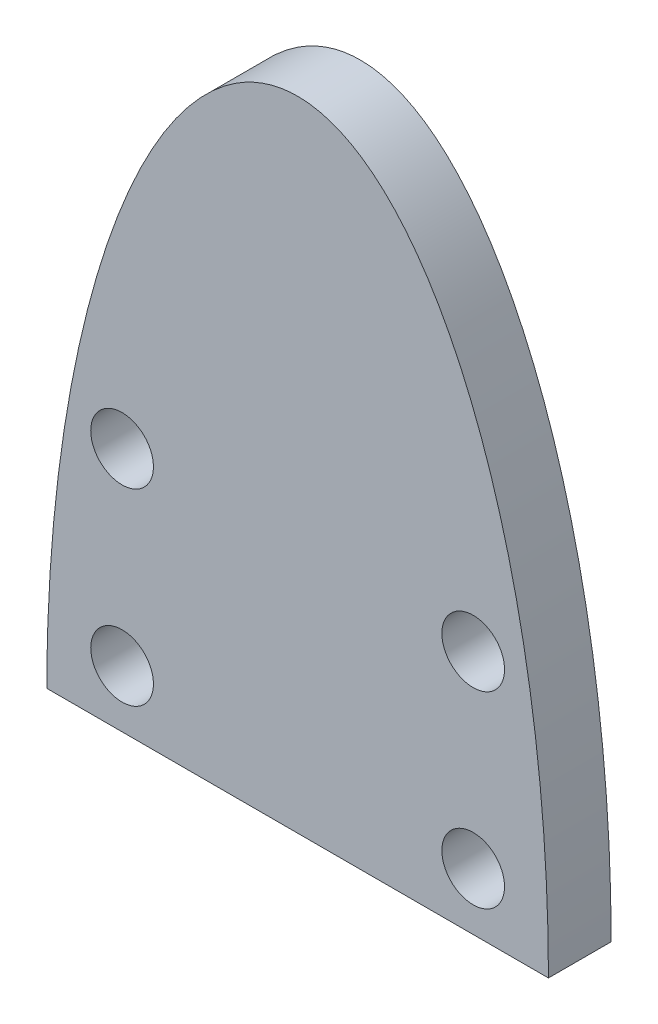
ISO-10303-21;
HEADER;
FILE_DESCRIPTION(('STEP AP214'),'2;1');
FILE_NAME('part.step','',(''),(''),'','','');
FILE_SCHEMA(('AUTOMOTIVE_DESIGN { 1 0 10303 214 1 1 1 1 }'));
ENDSEC;
DATA;
#1=APPLICATION_CONTEXT('core data for automotive mechanical design processes');
#2=APPLICATION_PROTOCOL_DEFINITION('international standard','automotive_design',2000,#1);
#3=PRODUCT_CONTEXT('',#1,'mechanical');
#4=PRODUCT('Part','Part','',(#3));
#5=PRODUCT_RELATED_PRODUCT_CATEGORY('part','',(#4));
#6=PRODUCT_DEFINITION_FORMATION('','',#4);
#7=PRODUCT_DEFINITION_CONTEXT('part definition',#1,'design');
#8=PRODUCT_DEFINITION('design','',#6,#7);
#9=PRODUCT_DEFINITION_SHAPE('','',#8);
#10=(LENGTH_UNIT() NAMED_UNIT(*) SI_UNIT(.MILLI.,.METRE.));
#11=(NAMED_UNIT(*) PLANE_ANGLE_UNIT() SI_UNIT($,.RADIAN.));
#12=(NAMED_UNIT(*) SI_UNIT($,.STERADIAN.) SOLID_ANGLE_UNIT());
#13=UNCERTAINTY_MEASURE_WITH_UNIT(LENGTH_MEASURE(1.E-05),#10,'distance_accuracy_value','');
#14=(GEOMETRIC_REPRESENTATION_CONTEXT(3) GLOBAL_UNCERTAINTY_ASSIGNED_CONTEXT((#13)) GLOBAL_UNIT_ASSIGNED_CONTEXT((#10,
#11,#12)) REPRESENTATION_CONTEXT('',''));
#15=CARTESIAN_POINT('',(0.,0.,0.));
#16=DIRECTION('',(0.,0.,1.));
#17=DIRECTION('',(1.,0.,0.));
#18=AXIS2_PLACEMENT_3D('',#15,#16,#17);
#19=CARTESIAN_POINT('',(50.8,0.,12.7));
#20=DIRECTION('',(0.,0.,1.));
#21=DIRECTION('',(0.,1.,0.));
#22=AXIS2_PLACEMENT_3D('',#19,#20,#21);
#23=ELLIPSE('',#22,129.286,50.8);
#24=DIRECTION('',(0.,0.,-1.));
#25=VECTOR('',#24,1.);
#26=SURFACE_OF_LINEAR_EXTRUSION('',#23,#25);
#27=CARTESIAN_POINT('',(50.8,0.,0.));
#28=DIRECTION('',(0.,0.,1.));
#29=DIRECTION('',(0.,1.,0.));
#30=AXIS2_PLACEMENT_3D('',#27,#28,#29);
#31=ELLIPSE('',#30,129.286,50.8);
#32=CARTESIAN_POINT('',(101.6,0.,0.));
#33=VERTEX_POINT('',#32);
#34=CARTESIAN_POINT('',(0.,0.,0.));
#35=VERTEX_POINT('',#34);
#36=EDGE_CURVE('E65',#33,#35,#31,.T.);
#37=ORIENTED_EDGE('',*,*,#36,.T.);
#38=DIRECTION('',(0.,0.,-1.));
#39=VECTOR('',#38,1.);
#40=CARTESIAN_POINT('',(0.,0.,12.7));
#41=LINE('',#40,#39);
#42=CARTESIAN_POINT('',(0.,0.,12.7));
#43=VERTEX_POINT('',#42);
#44=EDGE_CURVE('E11',#43,#35,#41,.T.);
#45=ORIENTED_EDGE('',*,*,#44,.F.);
#46=CARTESIAN_POINT('',(101.6,0.,12.7));
#47=VERTEX_POINT('',#46);
#48=EDGE_CURVE('E64',#47,#43,#23,.T.);
#49=ORIENTED_EDGE('',*,*,#48,.F.);
#50=DIRECTION('',(0.,0.,-1.));
#51=VECTOR('',#50,1.);
#52=CARTESIAN_POINT('',(101.6,0.,12.7));
#53=LINE('',#52,#51);
#54=EDGE_CURVE('E42',#47,#33,#53,.T.);
#55=ORIENTED_EDGE('',*,*,#54,.T.);
#56=EDGE_LOOP('',(#37,#45,#49,#55));
#57=FACE_BOUND('',#56,.T.);
#58=ADVANCED_FACE('F33',(#57),#26,.F.);
#59=CARTESIAN_POINT('',(0.,0.,12.7));
#60=DIRECTION('',(0.,1.,0.));
#61=DIRECTION('',(0.,0.,1.));
#62=AXIS2_PLACEMENT_3D('',#59,#60,#61);
#63=PLANE('',#62);
#64=DIRECTION('',(1.,0.,0.));
#65=VECTOR('',#64,1.);
#66=CARTESIAN_POINT('',(0.,0.,0.));
#67=LINE('',#66,#65);
#68=EDGE_CURVE('E57',#35,#33,#67,.T.);
#69=ORIENTED_EDGE('',*,*,#68,.T.);
#70=ORIENTED_EDGE('',*,*,#54,.F.);
#71=DIRECTION('',(1.,0.,0.));
#72=VECTOR('',#71,1.);
#73=CARTESIAN_POINT('',(0.,0.,12.7));
#74=LINE('',#73,#72);
#75=EDGE_CURVE('E49',#43,#47,#74,.T.);
#76=ORIENTED_EDGE('',*,*,#75,.F.);
#77=ORIENTED_EDGE('',*,*,#44,.T.);
#78=EDGE_LOOP('',(#69,#70,#76,#77));
#79=FACE_BOUND('',#78,.T.);
#80=ADVANCED_FACE('F60',(#79),#63,.F.);
#81=CARTESIAN_POINT('',(50.8,0.,12.7));
#82=DIRECTION('',(0.,0.,1.));
#83=DIRECTION('',(1.,0.,0.));
#84=AXIS2_PLACEMENT_3D('',#81,#82,#83);
#85=PLANE('',#84);
#86=CARTESIAN_POINT('',(86.36,11.5629463035803,12.7));
#87=DIRECTION('',(0.,0.,-1.));
#88=DIRECTION('',(-1.,0.,0.));
#89=AXIS2_PLACEMENT_3D('',#86,#87,#88);
#90=CIRCLE('',#89,6.35);
#91=CARTESIAN_POINT('',(80.01,11.5629463035803,12.7));
#92=VERTEX_POINT('',#91);
#93=EDGE_CURVE('E78',#92,#92,#90,.T.);
#94=ORIENTED_EDGE('',*,*,#93,.T.);
#95=EDGE_LOOP('',(#94));
#96=FACE_BOUND('',#95,.T.);
#97=CARTESIAN_POINT('',(15.24,49.6629463035803,12.7));
#98=DIRECTION('',(0.,0.,-1.));
#99=DIRECTION('',(-1.,0.,0.));
#100=AXIS2_PLACEMENT_3D('',#97,#98,#99);
#101=CIRCLE('',#100,6.35);
#102=CARTESIAN_POINT('',(8.89,49.6629463035803,12.7));
#103=VERTEX_POINT('',#102);
#104=EDGE_CURVE('E83',#103,#103,#101,.T.);
#105=ORIENTED_EDGE('',*,*,#104,.T.);
#106=EDGE_LOOP('',(#105));
#107=FACE_BOUND('',#106,.T.);
#108=CARTESIAN_POINT('',(15.24,11.5629463035803,12.7));
#109=DIRECTION('',(0.,0.,-1.));
#110=DIRECTION('',(-1.,0.,0.));
#111=AXIS2_PLACEMENT_3D('',#108,#109,#110);
#112=CIRCLE('',#111,6.35);
#113=CARTESIAN_POINT('',(8.89000000000001,11.5629463035803,12.7));
#114=VERTEX_POINT('',#113);
#115=EDGE_CURVE('E84',#114,#114,#112,.T.);
#116=ORIENTED_EDGE('',*,*,#115,.T.);
#117=EDGE_LOOP('',(#116));
#118=FACE_BOUND('',#117,.T.);
#119=CARTESIAN_POINT('',(86.36,49.6629463035803,12.7));
#120=DIRECTION('',(0.,0.,-1.));
#121=DIRECTION('',(-1.,0.,0.));
#122=AXIS2_PLACEMENT_3D('',#119,#120,#121);
#123=CIRCLE('',#122,6.35);
#124=CARTESIAN_POINT('',(80.01,49.6629463035803,12.7));
#125=VERTEX_POINT('',#124);
#126=EDGE_CURVE('E69',#125,#125,#123,.T.);
#127=ORIENTED_EDGE('',*,*,#126,.T.);
#128=EDGE_LOOP('',(#127));
#129=FACE_BOUND('',#128,.T.);
#130=ORIENTED_EDGE('',*,*,#48,.T.);
#131=ORIENTED_EDGE('',*,*,#75,.T.);
#132=EDGE_LOOP('',(#130,#131));
#133=FACE_BOUND('',#132,.T.);
#134=ADVANCED_FACE('F98',(#96,#107,#118,#129,#133),#85,.T.);
#135=CARTESIAN_POINT('',(50.8,0.,0.));
#136=DIRECTION('',(0.,0.,1.));
#137=DIRECTION('',(1.,0.,0.));
#138=AXIS2_PLACEMENT_3D('',#135,#136,#137);
#139=PLANE('',#138);
#140=CARTESIAN_POINT('',(86.36,11.5629463035803,0.));
#141=DIRECTION('',(0.,0.,-1.));
#142=DIRECTION('',(-1.,0.,0.));
#143=AXIS2_PLACEMENT_3D('',#140,#141,#142);
#144=CIRCLE('',#143,6.35);
#145=CARTESIAN_POINT('',(80.01,11.5629463035803,0.));
#146=VERTEX_POINT('',#145);
#147=EDGE_CURVE('E87',#146,#146,#144,.T.);
#148=ORIENTED_EDGE('',*,*,#147,.F.);
#149=EDGE_LOOP('',(#148));
#150=FACE_BOUND('',#149,.T.);
#151=CARTESIAN_POINT('',(15.24,49.6629463035803,0.));
#152=DIRECTION('',(0.,0.,-1.));
#153=DIRECTION('',(-1.,0.,0.));
#154=AXIS2_PLACEMENT_3D('',#151,#152,#153);
#155=CIRCLE('',#154,6.35);
#156=CARTESIAN_POINT('',(8.89,49.6629463035803,0.));
#157=VERTEX_POINT('',#156);
#158=EDGE_CURVE('E80',#157,#157,#155,.T.);
#159=ORIENTED_EDGE('',*,*,#158,.F.);
#160=EDGE_LOOP('',(#159));
#161=FACE_BOUND('',#160,.T.);
#162=CARTESIAN_POINT('',(15.24,11.5629463035803,0.));
#163=DIRECTION('',(0.,0.,-1.));
#164=DIRECTION('',(-1.,0.,0.));
#165=AXIS2_PLACEMENT_3D('',#162,#163,#164);
#166=CIRCLE('',#165,6.35);
#167=CARTESIAN_POINT('',(8.89000000000001,11.5629463035803,0.));
#168=VERTEX_POINT('',#167);
#169=EDGE_CURVE('E92',#168,#168,#166,.T.);
#170=ORIENTED_EDGE('',*,*,#169,.F.);
#171=EDGE_LOOP('',(#170));
#172=FACE_BOUND('',#171,.T.);
#173=CARTESIAN_POINT('',(86.36,49.6629463035803,0.));
#174=DIRECTION('',(0.,0.,-1.));
#175=DIRECTION('',(-1.,0.,0.));
#176=AXIS2_PLACEMENT_3D('',#173,#174,#175);
#177=CIRCLE('',#176,6.35);
#178=CARTESIAN_POINT('',(80.01,49.6629463035803,0.));
#179=VERTEX_POINT('',#178);
#180=EDGE_CURVE('E72',#179,#179,#177,.T.);
#181=ORIENTED_EDGE('',*,*,#180,.F.);
#182=EDGE_LOOP('',(#181));
#183=FACE_BOUND('',#182,.T.);
#184=ORIENTED_EDGE('',*,*,#36,.F.);
#185=ORIENTED_EDGE('',*,*,#68,.F.);
#186=EDGE_LOOP('',(#184,#185));
#187=FACE_BOUND('',#186,.T.);
#188=ADVANCED_FACE('F68',(#150,#161,#172,#183,#187),#139,.F.);
#189=CARTESIAN_POINT('',(86.36,49.6629463035803,12.7));
#190=DIRECTION('',(0.,0.,-1.));
#191=DIRECTION('',(-1.,0.,0.));
#192=AXIS2_PLACEMENT_3D('',#189,#190,#191);
#193=CYLINDRICAL_SURFACE('',#192,6.35);
#194=ORIENTED_EDGE('',*,*,#126,.F.);
#195=EDGE_LOOP('',(#194));
#196=FACE_BOUND('',#195,.T.);
#197=ORIENTED_EDGE('',*,*,#180,.T.);
#198=EDGE_LOOP('',(#197));
#199=FACE_BOUND('',#198,.T.);
#200=ADVANCED_FACE('F105',(#196,#199),#193,.F.);
#201=CARTESIAN_POINT('',(15.24,11.5629463035803,12.7));
#202=DIRECTION('',(0.,0.,-1.));
#203=DIRECTION('',(-1.,0.,0.));
#204=AXIS2_PLACEMENT_3D('',#201,#202,#203);
#205=CYLINDRICAL_SURFACE('',#204,6.35);
#206=ORIENTED_EDGE('',*,*,#115,.F.);
#207=EDGE_LOOP('',(#206));
#208=FACE_BOUND('',#207,.T.);
#209=ORIENTED_EDGE('',*,*,#169,.T.);
#210=EDGE_LOOP('',(#209));
#211=FACE_BOUND('',#210,.T.);
#212=ADVANCED_FACE('F101',(#208,#211),#205,.F.);
#213=CARTESIAN_POINT('',(15.24,49.6629463035803,12.7));
#214=DIRECTION('',(0.,0.,-1.));
#215=DIRECTION('',(-1.,0.,0.));
#216=AXIS2_PLACEMENT_3D('',#213,#214,#215);
#217=CYLINDRICAL_SURFACE('',#216,6.35);
#218=ORIENTED_EDGE('',*,*,#104,.F.);
#219=EDGE_LOOP('',(#218));
#220=FACE_BOUND('',#219,.T.);
#221=ORIENTED_EDGE('',*,*,#158,.T.);
#222=EDGE_LOOP('',(#221));
#223=FACE_BOUND('',#222,.T.);
#224=ADVANCED_FACE('F104',(#220,#223),#217,.F.);
#225=CARTESIAN_POINT('',(86.36,11.5629463035803,12.7));
#226=DIRECTION('',(0.,0.,-1.));
#227=DIRECTION('',(-1.,0.,0.));
#228=AXIS2_PLACEMENT_3D('',#225,#226,#227);
#229=CYLINDRICAL_SURFACE('',#228,6.35);
#230=ORIENTED_EDGE('',*,*,#93,.F.);
#231=EDGE_LOOP('',(#230));
#232=FACE_BOUND('',#231,.T.);
#233=ORIENTED_EDGE('',*,*,#147,.T.);
#234=EDGE_LOOP('',(#233));
#235=FACE_BOUND('',#234,.T.);
#236=ADVANCED_FACE('F139',(#232,#235),#229,.F.);
#237=CLOSED_SHELL('',(#58,#80,#134,#188,#200,#212,#224,#236));
#238=MANIFOLD_SOLID_BREP('B2',#237);
#239=ADVANCED_BREP_SHAPE_REPRESENTATION('',(#18,#238),#14);
#240=SHAPE_DEFINITION_REPRESENTATION(#9,#239);
ENDSEC;
END-ISO-10303-21;
